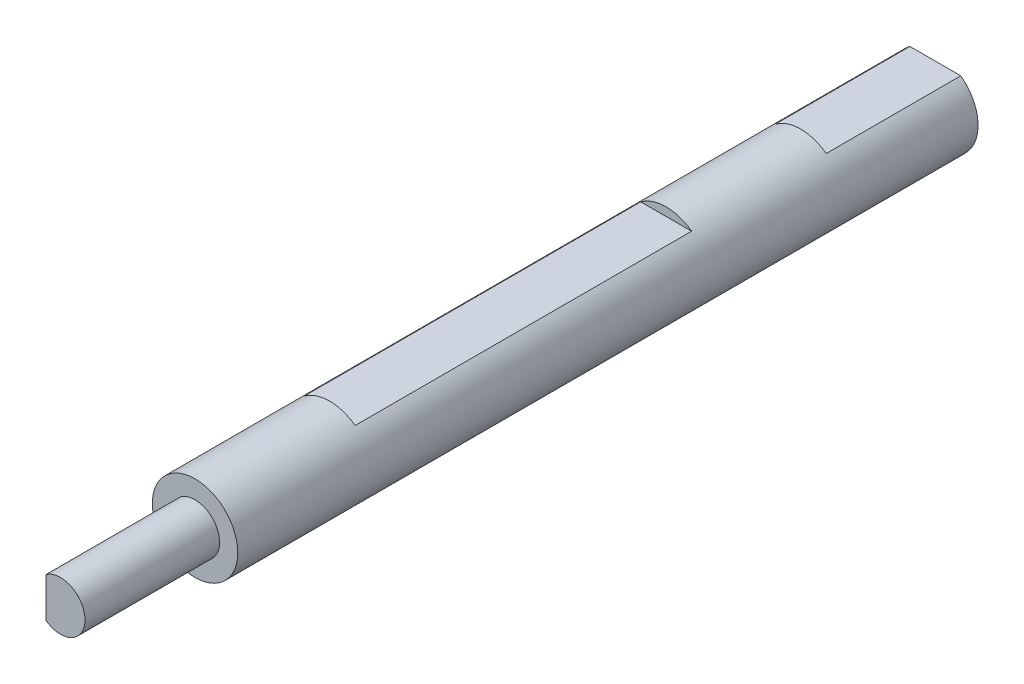
ISO-10303-21;
HEADER;
FILE_DESCRIPTION(('STEP AP214'),'2;1');
FILE_NAME('part.step','',(''),(''),'','','');
FILE_SCHEMA(('AUTOMOTIVE_DESIGN { 1 0 10303 214 1 1 1 1 }'));
ENDSEC;
DATA;
#1=APPLICATION_CONTEXT('core data for automotive mechanical design processes');
#2=APPLICATION_PROTOCOL_DEFINITION('international standard','automotive_design',2000,#1);
#3=PRODUCT_CONTEXT('',#1,'mechanical');
#4=PRODUCT('Part','Part','',(#3));
#5=PRODUCT_RELATED_PRODUCT_CATEGORY('part','',(#4));
#6=PRODUCT_DEFINITION_FORMATION('','',#4);
#7=PRODUCT_DEFINITION_CONTEXT('part definition',#1,'design');
#8=PRODUCT_DEFINITION('design','',#6,#7);
#9=PRODUCT_DEFINITION_SHAPE('','',#8);
#10=(LENGTH_UNIT() NAMED_UNIT(*) SI_UNIT(.MILLI.,.METRE.));
#11=(NAMED_UNIT(*) PLANE_ANGLE_UNIT() SI_UNIT($,.RADIAN.));
#12=(NAMED_UNIT(*) SI_UNIT($,.STERADIAN.) SOLID_ANGLE_UNIT());
#13=UNCERTAINTY_MEASURE_WITH_UNIT(LENGTH_MEASURE(1.E-05),#10,'distance_accuracy_value','');
#14=(GEOMETRIC_REPRESENTATION_CONTEXT(3) GLOBAL_UNCERTAINTY_ASSIGNED_CONTEXT((#13)) GLOBAL_UNIT_ASSIGNED_CONTEXT((#10,
#11,#12)) REPRESENTATION_CONTEXT('',''));
#15=CARTESIAN_POINT('',(0.,0.,0.));
#16=DIRECTION('',(0.,0.,1.));
#17=DIRECTION('',(1.,0.,0.));
#18=AXIS2_PLACEMENT_3D('',#15,#16,#17);
#19=CARTESIAN_POINT('',(0.,0.,65.));
#20=DIRECTION('',(0.,0.,-1.));
#21=DIRECTION('',(-1.,0.,0.));
#22=AXIS2_PLACEMENT_3D('',#19,#20,#21);
#23=CYLINDRICAL_SURFACE('',#22,3.175);
#24=CARTESIAN_POINT('',(0.,0.,45.));
#25=DIRECTION('',(0.,0.,-1.));
#26=DIRECTION('',(-1.,0.,0.));
#27=AXIS2_PLACEMENT_3D('',#24,#25,#26);
#28=CIRCLE('',#27,3.175);
#29=CARTESIAN_POINT('',(-1.8915932438027,2.55,45.));
#30=VERTEX_POINT('',#29);
#31=CARTESIAN_POINT('',(1.8915932438027,2.55,45.));
#32=VERTEX_POINT('',#31);
#33=EDGE_CURVE('E124',#30,#32,#28,.T.);
#34=ORIENTED_EDGE('',*,*,#33,.F.);
#35=DIRECTION('',(0.,0.,-1.));
#36=VECTOR('',#35,1.);
#37=CARTESIAN_POINT('',(-1.8915932438027,2.55,45.));
#38=LINE('',#37,#36);
#39=CARTESIAN_POINT('',(-1.8915932438027,2.55,20.));
#40=VERTEX_POINT('',#39);
#41=EDGE_CURVE('E133',#30,#40,#38,.T.);
#42=ORIENTED_EDGE('',*,*,#41,.T.);
#43=CARTESIAN_POINT('',(0.,0.,20.));
#44=DIRECTION('',(0.,0.,-1.));
#45=DIRECTION('',(-1.,0.,0.));
#46=AXIS2_PLACEMENT_3D('',#43,#44,#45);
#47=CIRCLE('',#46,3.175);
#48=CARTESIAN_POINT('',(1.8915932438027,2.55,20.));
#49=VERTEX_POINT('',#48);
#50=EDGE_CURVE('E123',#40,#49,#47,.T.);
#51=ORIENTED_EDGE('',*,*,#50,.T.);
#52=DIRECTION('',(0.,0.,-1.));
#53=VECTOR('',#52,1.);
#54=CARTESIAN_POINT('',(1.8915932438027,2.55,45.));
#55=LINE('',#54,#53);
#56=EDGE_CURVE('E129',#32,#49,#55,.T.);
#57=ORIENTED_EDGE('',*,*,#56,.F.);
#58=EDGE_LOOP('',(#34,#42,#51,#57));
#59=FACE_BOUND('',#58,.T.);
#60=CARTESIAN_POINT('',(0.,0.,10.));
#61=DIRECTION('',(0.,0.,-1.));
#62=DIRECTION('',(-1.,0.,0.));
#63=AXIS2_PLACEMENT_3D('',#60,#61,#62);
#64=CIRCLE('',#63,3.175);
#65=CARTESIAN_POINT('',(-1.89159324380269,2.55,10.));
#66=VERTEX_POINT('',#65);
#67=CARTESIAN_POINT('',(1.8915932438027,2.55,10.));
#68=VERTEX_POINT('',#67);
#69=EDGE_CURVE('E138',#66,#68,#64,.T.);
#70=ORIENTED_EDGE('',*,*,#69,.F.);
#71=DIRECTION('',(0.,0.,-1.));
#72=VECTOR('',#71,1.);
#73=CARTESIAN_POINT('',(-1.89159324380269,2.55,10.));
#74=LINE('',#73,#72);
#75=CARTESIAN_POINT('',(-1.89159324380269,2.55,0.));
#76=VERTEX_POINT('',#75);
#77=EDGE_CURVE('E147',#66,#76,#74,.T.);
#78=ORIENTED_EDGE('',*,*,#77,.T.);
#79=CARTESIAN_POINT('',(0.,0.,0.));
#80=DIRECTION('',(0.,0.,1.));
#81=DIRECTION('',(1.,0.,0.));
#82=AXIS2_PLACEMENT_3D('',#79,#80,#81);
#83=CIRCLE('',#82,3.175);
#84=CARTESIAN_POINT('',(-1.89159324380269,-2.55,0.));
#85=VERTEX_POINT('',#84);
#86=EDGE_CURVE('E11',#76,#85,#83,.T.);
#87=ORIENTED_EDGE('',*,*,#86,.T.);
#88=DIRECTION('',(0.,0.,-1.));
#89=VECTOR('',#88,1.);
#90=CARTESIAN_POINT('',(-1.89159324380269,-2.55,10.));
#91=LINE('',#90,#89);
#92=CARTESIAN_POINT('',(-1.89159324380269,-2.55,10.));
#93=VERTEX_POINT('',#92);
#94=EDGE_CURVE('E156',#93,#85,#91,.T.);
#95=ORIENTED_EDGE('',*,*,#94,.F.);
#96=CARTESIAN_POINT('',(0.,0.,10.));
#97=DIRECTION('',(0.,0.,-1.));
#98=DIRECTION('',(-1.,0.,0.));
#99=AXIS2_PLACEMENT_3D('',#96,#97,#98);
#100=CIRCLE('',#99,3.175);
#101=CARTESIAN_POINT('',(1.89159324380269,-2.55,10.));
#102=VERTEX_POINT('',#101);
#103=EDGE_CURVE('E151',#102,#93,#100,.T.);
#104=ORIENTED_EDGE('',*,*,#103,.F.);
#105=DIRECTION('',(0.,0.,-1.));
#106=VECTOR('',#105,1.);
#107=CARTESIAN_POINT('',(1.89159324380269,-2.55,10.));
#108=LINE('',#107,#106);
#109=CARTESIAN_POINT('',(1.89159324380269,-2.55,0.));
#110=VERTEX_POINT('',#109);
#111=EDGE_CURVE('E146',#102,#110,#108,.T.);
#112=ORIENTED_EDGE('',*,*,#111,.T.);
#113=CARTESIAN_POINT('',(1.8915932438027,2.55,0.));
#114=VERTEX_POINT('',#113);
#115=EDGE_CURVE('E38',#110,#114,#83,.T.);
#116=ORIENTED_EDGE('',*,*,#115,.T.);
#117=DIRECTION('',(0.,0.,-1.));
#118=VECTOR('',#117,1.);
#119=CARTESIAN_POINT('',(1.8915932438027,2.55,10.));
#120=LINE('',#119,#118);
#121=EDGE_CURVE('E144',#68,#114,#120,.T.);
#122=ORIENTED_EDGE('',*,*,#121,.F.);
#123=EDGE_LOOP('',(#70,#78,#87,#95,#104,#112,#116,#122));
#124=FACE_BOUND('',#123,.T.);
#125=CARTESIAN_POINT('',(0.,0.,55.));
#126=DIRECTION('',(0.,0.,1.));
#127=DIRECTION('',(1.,0.,0.));
#128=AXIS2_PLACEMENT_3D('',#125,#126,#127);
#129=CIRCLE('',#128,3.175);
#130=CARTESIAN_POINT('',(3.175,0.,55.));
#131=VERTEX_POINT('',#130);
#132=EDGE_CURVE('E119',#131,#131,#129,.T.);
#133=ORIENTED_EDGE('',*,*,#132,.F.);
#134=EDGE_LOOP('',(#133));
#135=FACE_BOUND('',#134,.T.);
#136=ADVANCED_FACE('F35',(#59,#124,#135),#23,.T.);
#137=CARTESIAN_POINT('',(0.,0.,0.));
#138=DIRECTION('',(0.,0.,1.));
#139=DIRECTION('',(1.,0.,0.));
#140=AXIS2_PLACEMENT_3D('',#137,#138,#139);
#141=PLANE('',#140);
#142=ORIENTED_EDGE('',*,*,#86,.F.);
#143=DIRECTION('',(-1.,0.,0.));
#144=VECTOR('',#143,1.);
#145=CARTESIAN_POINT('',(1.8915932438027,2.55,0.));
#146=LINE('',#145,#144);
#147=EDGE_CURVE('E141',#114,#76,#146,.T.);
#148=ORIENTED_EDGE('',*,*,#147,.F.);
#149=ORIENTED_EDGE('',*,*,#115,.F.);
#150=DIRECTION('',(1.,0.,0.));
#151=VECTOR('',#150,1.);
#152=CARTESIAN_POINT('',(1.89159324380269,-2.55,0.));
#153=LINE('',#152,#151);
#154=EDGE_CURVE('E136',#85,#110,#153,.T.);
#155=ORIENTED_EDGE('',*,*,#154,.F.);
#156=EDGE_LOOP('',(#142,#148,#149,#155));
#157=FACE_BOUND('',#156,.T.);
#158=ADVANCED_FACE('F169',(#157),#141,.F.);
#159=CARTESIAN_POINT('',(1.89159324380269,-2.55,10.));
#160=DIRECTION('',(0.,1.,0.));
#161=DIRECTION('',(0.,0.,1.));
#162=AXIS2_PLACEMENT_3D('',#159,#160,#161);
#163=PLANE('',#162);
#164=ORIENTED_EDGE('',*,*,#154,.T.);
#165=ORIENTED_EDGE('',*,*,#111,.F.);
#166=DIRECTION('',(1.,0.,0.));
#167=VECTOR('',#166,1.);
#168=CARTESIAN_POINT('',(1.89159324380269,-2.55,10.));
#169=LINE('',#168,#167);
#170=EDGE_CURVE('E153',#93,#102,#169,.T.);
#171=ORIENTED_EDGE('',*,*,#170,.F.);
#172=ORIENTED_EDGE('',*,*,#94,.T.);
#173=EDGE_LOOP('',(#164,#165,#171,#172));
#174=FACE_BOUND('',#173,.T.);
#175=ADVANCED_FACE('F163',(#174),#163,.F.);
#176=CARTESIAN_POINT('',(0.,0.,10.));
#177=DIRECTION('',(0.,0.,-1.));
#178=DIRECTION('',(-1.,0.,0.));
#179=AXIS2_PLACEMENT_3D('',#176,#177,#178);
#180=PLANE('',#179);
#181=ORIENTED_EDGE('',*,*,#103,.T.);
#182=ORIENTED_EDGE('',*,*,#170,.T.);
#183=EDGE_LOOP('',(#181,#182));
#184=FACE_BOUND('',#183,.T.);
#185=ADVANCED_FACE('F190',(#184),#180,.T.);
#186=CARTESIAN_POINT('',(1.8915932438027,2.55,10.));
#187=DIRECTION('',(0.,-1.,0.));
#188=DIRECTION('',(1.,0.,0.));
#189=AXIS2_PLACEMENT_3D('',#186,#187,#188);
#190=PLANE('',#189);
#191=ORIENTED_EDGE('',*,*,#147,.T.);
#192=ORIENTED_EDGE('',*,*,#77,.F.);
#193=DIRECTION('',(-1.,0.,0.));
#194=VECTOR('',#193,1.);
#195=CARTESIAN_POINT('',(1.8915932438027,2.55,10.));
#196=LINE('',#195,#194);
#197=EDGE_CURVE('E140',#68,#66,#196,.T.);
#198=ORIENTED_EDGE('',*,*,#197,.F.);
#199=ORIENTED_EDGE('',*,*,#121,.T.);
#200=EDGE_LOOP('',(#191,#192,#198,#199));
#201=FACE_BOUND('',#200,.T.);
#202=ADVANCED_FACE('F177',(#201),#190,.F.);
#203=CARTESIAN_POINT('',(0.,0.,10.));
#204=DIRECTION('',(0.,0.,-1.));
#205=DIRECTION('',(-1.,0.,0.));
#206=AXIS2_PLACEMENT_3D('',#203,#204,#205);
#207=PLANE('',#206);
#208=ORIENTED_EDGE('',*,*,#69,.T.);
#209=ORIENTED_EDGE('',*,*,#197,.T.);
#210=EDGE_LOOP('',(#208,#209));
#211=FACE_BOUND('',#210,.T.);
#212=ADVANCED_FACE('F179',(#211),#207,.T.);
#213=CARTESIAN_POINT('',(1.8915932438027,2.55,45.));
#214=DIRECTION('',(0.,-1.,0.));
#215=DIRECTION('',(0.,0.,-1.));
#216=AXIS2_PLACEMENT_3D('',#213,#214,#215);
#217=PLANE('',#216);
#218=DIRECTION('',(-1.,0.,0.));
#219=VECTOR('',#218,1.);
#220=CARTESIAN_POINT('',(1.8915932438027,2.55,20.));
#221=LINE('',#220,#219);
#222=EDGE_CURVE('E56',#49,#40,#221,.T.);
#223=ORIENTED_EDGE('',*,*,#222,.T.);
#224=ORIENTED_EDGE('',*,*,#41,.F.);
#225=DIRECTION('',(-1.,0.,0.));
#226=VECTOR('',#225,1.);
#227=CARTESIAN_POINT('',(1.8915932438027,2.55,45.));
#228=LINE('',#227,#226);
#229=EDGE_CURVE('E126',#32,#30,#228,.T.);
#230=ORIENTED_EDGE('',*,*,#229,.F.);
#231=ORIENTED_EDGE('',*,*,#56,.T.);
#232=EDGE_LOOP('',(#223,#224,#230,#231));
#233=FACE_BOUND('',#232,.T.);
#234=ADVANCED_FACE('F181',(#233),#217,.F.);
#235=CARTESIAN_POINT('',(0.,0.,45.));
#236=DIRECTION('',(0.,0.,-1.));
#237=DIRECTION('',(-1.,0.,0.));
#238=AXIS2_PLACEMENT_3D('',#235,#236,#237);
#239=PLANE('',#238);
#240=ORIENTED_EDGE('',*,*,#33,.T.);
#241=ORIENTED_EDGE('',*,*,#229,.T.);
#242=EDGE_LOOP('',(#240,#241));
#243=FACE_BOUND('',#242,.T.);
#244=ADVANCED_FACE('F187',(#243),#239,.T.);
#245=CARTESIAN_POINT('',(0.,0.,20.));
#246=DIRECTION('',(0.,0.,-1.));
#247=DIRECTION('',(-1.,0.,0.));
#248=AXIS2_PLACEMENT_3D('',#245,#246,#247);
#249=PLANE('',#248);
#250=ORIENTED_EDGE('',*,*,#50,.F.);
#251=ORIENTED_EDGE('',*,*,#222,.F.);
#252=EDGE_LOOP('',(#250,#251));
#253=FACE_BOUND('',#252,.T.);
#254=ADVANCED_FACE('F201',(#253),#249,.F.);
#255=CARTESIAN_POINT('',(0.,0.,55.));
#256=DIRECTION('',(0.,0.,1.));
#257=DIRECTION('',(1.,0.,0.));
#258=AXIS2_PLACEMENT_3D('',#255,#256,#257);
#259=PLANE('',#258);
#260=DIRECTION('',(0.,-1.,0.));
#261=VECTOR('',#260,1.);
#262=CARTESIAN_POINT('',(-1.073,-1.47871565894191,55.));
#263=LINE('',#262,#261);
#264=CARTESIAN_POINT('',(-1.073,1.47871565894191,55.));
#265=VERTEX_POINT('',#264);
#266=CARTESIAN_POINT('',(-1.073,-1.47871565894191,55.));
#267=VERTEX_POINT('',#266);
#268=EDGE_CURVE('E103',#265,#267,#263,.T.);
#269=ORIENTED_EDGE('',*,*,#268,.F.);
#270=CARTESIAN_POINT('',(0.,0.,55.));
#271=DIRECTION('',(0.,0.,1.));
#272=DIRECTION('',(1.,0.,0.));
#273=AXIS2_PLACEMENT_3D('',#270,#271,#272);
#274=CIRCLE('',#273,1.827);
#275=EDGE_CURVE('E112',#267,#265,#274,.T.);
#276=ORIENTED_EDGE('',*,*,#275,.F.);
#277=EDGE_LOOP('',(#269,#276));
#278=FACE_BOUND('',#277,.T.);
#279=ORIENTED_EDGE('',*,*,#132,.T.);
#280=EDGE_LOOP('',(#279));
#281=FACE_BOUND('',#280,.T.);
#282=ADVANCED_FACE('F110',(#278,#281),#259,.T.);
#283=CARTESIAN_POINT('',(0.,0.,55.));
#284=DIRECTION('',(0.,0.,1.));
#285=DIRECTION('',(1.,0.,0.));
#286=AXIS2_PLACEMENT_3D('',#283,#284,#285);
#287=CYLINDRICAL_SURFACE('',#286,1.827);
#288=CARTESIAN_POINT('',(0.,0.,65.));
#289=DIRECTION('',(0.,0.,1.));
#290=DIRECTION('',(1.,0.,0.));
#291=AXIS2_PLACEMENT_3D('',#288,#289,#290);
#292=CIRCLE('',#291,1.827);
#293=CARTESIAN_POINT('',(-1.073,-1.47871565894191,65.));
#294=VERTEX_POINT('',#293);
#295=CARTESIAN_POINT('',(-1.073,1.47871565894191,65.));
#296=VERTEX_POINT('',#295);
#297=EDGE_CURVE('E49',#294,#296,#292,.T.);
#298=ORIENTED_EDGE('',*,*,#297,.F.);
#299=DIRECTION('',(0.,0.,1.));
#300=VECTOR('',#299,1.);
#301=CARTESIAN_POINT('',(-1.073,-1.47871565894191,55.));
#302=LINE('',#301,#300);
#303=EDGE_CURVE('E107',#267,#294,#302,.T.);
#304=ORIENTED_EDGE('',*,*,#303,.F.);
#305=ORIENTED_EDGE('',*,*,#275,.T.);
#306=DIRECTION('',(0.,0.,1.));
#307=VECTOR('',#306,1.);
#308=CARTESIAN_POINT('',(-1.073,1.47871565894191,55.));
#309=LINE('',#308,#307);
#310=EDGE_CURVE('E100',#265,#296,#309,.T.);
#311=ORIENTED_EDGE('',*,*,#310,.T.);
#312=EDGE_LOOP('',(#298,#304,#305,#311));
#313=FACE_BOUND('',#312,.T.);
#314=ADVANCED_FACE('F114',(#313),#287,.T.);
#315=CARTESIAN_POINT('',(-1.073,-1.47871565894191,55.));
#316=DIRECTION('',(-1.,0.,0.));
#317=DIRECTION('',(0.,0.,1.));
#318=AXIS2_PLACEMENT_3D('',#315,#316,#317);
#319=PLANE('',#318);
#320=DIRECTION('',(0.,-1.,0.));
#321=VECTOR('',#320,1.);
#322=CARTESIAN_POINT('',(-1.073,-1.47871565894191,65.));
#323=LINE('',#322,#321);
#324=EDGE_CURVE('E105',#296,#294,#323,.T.);
#325=ORIENTED_EDGE('',*,*,#324,.F.);
#326=ORIENTED_EDGE('',*,*,#310,.F.);
#327=ORIENTED_EDGE('',*,*,#268,.T.);
#328=ORIENTED_EDGE('',*,*,#303,.T.);
#329=EDGE_LOOP('',(#325,#326,#327,#328));
#330=FACE_BOUND('',#329,.T.);
#331=ADVANCED_FACE('F102',(#330),#319,.T.);
#332=CARTESIAN_POINT('',(0.,0.,65.));
#333=DIRECTION('',(0.,0.,1.));
#334=DIRECTION('',(1.,0.,0.));
#335=AXIS2_PLACEMENT_3D('',#332,#333,#334);
#336=PLANE('',#335);
#337=ORIENTED_EDGE('',*,*,#324,.T.);
#338=ORIENTED_EDGE('',*,*,#297,.T.);
#339=EDGE_LOOP('',(#337,#338));
#340=FACE_BOUND('',#339,.T.);
#341=ADVANCED_FACE('F214',(#340),#336,.T.);
#342=CLOSED_SHELL('',(#136,#158,#175,#185,#202,#212,#234,#244,#254,#282,#314,#331,#341));
#343=MANIFOLD_SOLID_BREP('B2',#342);
#344=ADVANCED_BREP_SHAPE_REPRESENTATION('',(#18,#343),#14);
#345=SHAPE_DEFINITION_REPRESENTATION(#9,#344);
ENDSEC;
END-ISO-10303-21;
